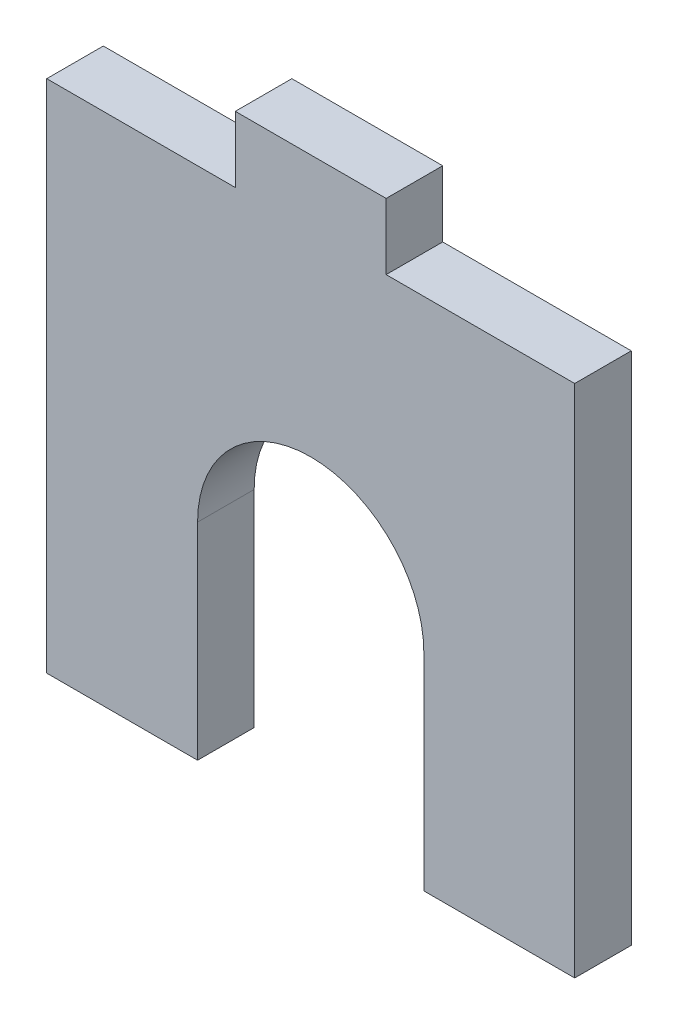
ISO-10303-21;
HEADER;
FILE_DESCRIPTION(('STEP AP214'),'2;1');
FILE_NAME('part.step','',(''),(''),'','','');
FILE_SCHEMA(('AUTOMOTIVE_DESIGN { 1 0 10303 214 1 1 1 1 }'));
ENDSEC;
DATA;
#1=APPLICATION_CONTEXT('core data for automotive mechanical design processes');
#2=APPLICATION_PROTOCOL_DEFINITION('international standard','automotive_design',2000,#1);
#3=PRODUCT_CONTEXT('',#1,'mechanical');
#4=PRODUCT('Part','Part','',(#3));
#5=PRODUCT_RELATED_PRODUCT_CATEGORY('part','',(#4));
#6=PRODUCT_DEFINITION_FORMATION('','',#4);
#7=PRODUCT_DEFINITION_CONTEXT('part definition',#1,'design');
#8=PRODUCT_DEFINITION('design','',#6,#7);
#9=PRODUCT_DEFINITION_SHAPE('','',#8);
#10=(LENGTH_UNIT() NAMED_UNIT(*) SI_UNIT(.MILLI.,.METRE.));
#11=(NAMED_UNIT(*) PLANE_ANGLE_UNIT() SI_UNIT($,.RADIAN.));
#12=(NAMED_UNIT(*) SI_UNIT($,.STERADIAN.) SOLID_ANGLE_UNIT());
#13=UNCERTAINTY_MEASURE_WITH_UNIT(LENGTH_MEASURE(1.E-05),#10,'distance_accuracy_value','');
#14=(GEOMETRIC_REPRESENTATION_CONTEXT(3) GLOBAL_UNCERTAINTY_ASSIGNED_CONTEXT((#13)) GLOBAL_UNIT_ASSIGNED_CONTEXT((#10,
#11,#12)) REPRESENTATION_CONTEXT('',''));
#15=CARTESIAN_POINT('',(0.,0.,0.));
#16=DIRECTION('',(0.,0.,1.));
#17=DIRECTION('',(1.,0.,0.));
#18=AXIS2_PLACEMENT_3D('',#15,#16,#17);
#19=CARTESIAN_POINT('',(-14.,-10.9375,3.));
#20=DIRECTION('',(1.,0.,0.));
#21=DIRECTION('',(0.,0.,-1.));
#22=AXIS2_PLACEMENT_3D('',#19,#20,#21);
#23=PLANE('',#22);
#24=DIRECTION('',(0.,-1.,0.));
#25=VECTOR('',#24,1.);
#26=CARTESIAN_POINT('',(-14.,-10.9375,0.));
#27=LINE('',#26,#25);
#28=CARTESIAN_POINT('',(-14.,16.3676805868088,0.));
#29=VERTEX_POINT('',#28);
#30=CARTESIAN_POINT('',(-14.,-10.9375,0.));
#31=VERTEX_POINT('',#30);
#32=EDGE_CURVE('E155',#29,#31,#27,.T.);
#33=ORIENTED_EDGE('',*,*,#32,.T.);
#34=DIRECTION('',(0.,0.,-1.));
#35=VECTOR('',#34,1.);
#36=CARTESIAN_POINT('',(-14.,-10.9375,3.));
#37=LINE('',#36,#35);
#38=CARTESIAN_POINT('',(-14.,-10.9375,3.));
#39=VERTEX_POINT('',#38);
#40=EDGE_CURVE('E11',#39,#31,#37,.T.);
#41=ORIENTED_EDGE('',*,*,#40,.F.);
#42=DIRECTION('',(0.,-1.,0.));
#43=VECTOR('',#42,1.);
#44=CARTESIAN_POINT('',(-14.,-10.9375,3.));
#45=LINE('',#44,#43);
#46=CARTESIAN_POINT('',(-14.,16.3676805868088,3.));
#47=VERTEX_POINT('',#46);
#48=EDGE_CURVE('E177',#47,#39,#45,.T.);
#49=ORIENTED_EDGE('',*,*,#48,.F.);
#50=DIRECTION('',(0.,0.,-1.));
#51=VECTOR('',#50,1.);
#52=CARTESIAN_POINT('',(-14.,16.3676805868088,3.));
#53=LINE('',#52,#51);
#54=EDGE_CURVE('E151',#47,#29,#53,.T.);
#55=ORIENTED_EDGE('',*,*,#54,.T.);
#56=EDGE_LOOP('',(#33,#41,#49,#55));
#57=FACE_BOUND('',#56,.T.);
#58=ADVANCED_FACE('F35',(#57),#23,.F.);
#59=CARTESIAN_POINT('',(-14.,-10.9375,3.));
#60=DIRECTION('',(0.,1.,0.));
#61=DIRECTION('',(0.,0.,1.));
#62=AXIS2_PLACEMENT_3D('',#59,#60,#61);
#63=PLANE('',#62);
#64=DIRECTION('',(1.,0.,0.));
#65=VECTOR('',#64,1.);
#66=CARTESIAN_POINT('',(-14.,-10.9375,0.));
#67=LINE('',#66,#65);
#68=CARTESIAN_POINT('',(-6.,-10.9375,0.));
#69=VERTEX_POINT('',#68);
#70=EDGE_CURVE('E158',#31,#69,#67,.T.);
#71=ORIENTED_EDGE('',*,*,#70,.T.);
#72=DIRECTION('',(0.,0.,-1.));
#73=VECTOR('',#72,1.);
#74=CARTESIAN_POINT('',(-6.,-10.9375,3.));
#75=LINE('',#74,#73);
#76=CARTESIAN_POINT('',(-6.,-10.9375,3.));
#77=VERTEX_POINT('',#76);
#78=EDGE_CURVE('E43',#77,#69,#75,.T.);
#79=ORIENTED_EDGE('',*,*,#78,.F.);
#80=DIRECTION('',(1.,0.,0.));
#81=VECTOR('',#80,1.);
#82=CARTESIAN_POINT('',(-14.,-10.9375,3.));
#83=LINE('',#82,#81);
#84=EDGE_CURVE('E106',#39,#77,#83,.T.);
#85=ORIENTED_EDGE('',*,*,#84,.F.);
#86=ORIENTED_EDGE('',*,*,#40,.T.);
#87=EDGE_LOOP('',(#71,#79,#85,#86));
#88=FACE_BOUND('',#87,.T.);
#89=ADVANCED_FACE('F255',(#88),#63,.F.);
#90=CARTESIAN_POINT('',(-6.,0.,3.));
#91=DIRECTION('',(-1.,0.,0.));
#92=DIRECTION('',(0.,-1.,0.));
#93=AXIS2_PLACEMENT_3D('',#90,#91,#92);
#94=PLANE('',#93);
#95=DIRECTION('',(0.,1.,0.));
#96=VECTOR('',#95,1.);
#97=CARTESIAN_POINT('',(-6.,0.,0.));
#98=LINE('',#97,#96);
#99=CARTESIAN_POINT('',(-6.,0.,0.));
#100=VERTEX_POINT('',#99);
#101=EDGE_CURVE('E160',#69,#100,#98,.T.);
#102=ORIENTED_EDGE('',*,*,#101,.T.);
#103=DIRECTION('',(0.,0.,-1.));
#104=VECTOR('',#103,1.);
#105=CARTESIAN_POINT('',(-6.,0.,3.));
#106=LINE('',#105,#104);
#107=CARTESIAN_POINT('',(-6.,0.,3.));
#108=VERTEX_POINT('',#107);
#109=EDGE_CURVE('E196',#108,#100,#106,.T.);
#110=ORIENTED_EDGE('',*,*,#109,.F.);
#111=DIRECTION('',(0.,1.,0.));
#112=VECTOR('',#111,1.);
#113=CARTESIAN_POINT('',(-6.,0.,3.));
#114=LINE('',#113,#112);
#115=EDGE_CURVE('E204',#77,#108,#114,.T.);
#116=ORIENTED_EDGE('',*,*,#115,.F.);
#117=ORIENTED_EDGE('',*,*,#78,.T.);
#118=EDGE_LOOP('',(#102,#110,#116,#117));
#119=FACE_BOUND('',#118,.T.);
#120=ADVANCED_FACE('F202',(#119),#94,.F.);
#121=CARTESIAN_POINT('',(0.,0.,3.));
#122=DIRECTION('',(0.,0.,-1.));
#123=DIRECTION('',(-1.,0.,0.));
#124=AXIS2_PLACEMENT_3D('',#121,#122,#123);
#125=CYLINDRICAL_SURFACE('',#124,6.);
#126=CARTESIAN_POINT('',(0.,0.,0.));
#127=DIRECTION('',(0.,0.,-1.));
#128=DIRECTION('',(1.,0.,0.));
#129=AXIS2_PLACEMENT_3D('',#126,#127,#128);
#130=CIRCLE('',#129,6.);
#131=CARTESIAN_POINT('',(6.,0.,0.));
#132=VERTEX_POINT('',#131);
#133=EDGE_CURVE('E162',#100,#132,#130,.T.);
#134=ORIENTED_EDGE('',*,*,#133,.T.);
#135=DIRECTION('',(0.,0.,-1.));
#136=VECTOR('',#135,1.);
#137=CARTESIAN_POINT('',(6.,0.,3.));
#138=LINE('',#137,#136);
#139=CARTESIAN_POINT('',(6.,0.,3.));
#140=VERTEX_POINT('',#139);
#141=EDGE_CURVE('E193',#140,#132,#138,.T.);
#142=ORIENTED_EDGE('',*,*,#141,.F.);
#143=CARTESIAN_POINT('',(0.,0.,3.));
#144=DIRECTION('',(0.,0.,-1.));
#145=DIRECTION('',(1.,0.,0.));
#146=AXIS2_PLACEMENT_3D('',#143,#144,#145);
#147=CIRCLE('',#146,6.);
#148=EDGE_CURVE('E222',#108,#140,#147,.T.);
#149=ORIENTED_EDGE('',*,*,#148,.F.);
#150=ORIENTED_EDGE('',*,*,#109,.T.);
#151=EDGE_LOOP('',(#134,#142,#149,#150));
#152=FACE_BOUND('',#151,.T.);
#153=ADVANCED_FACE('F213',(#152),#125,.F.);
#154=CARTESIAN_POINT('',(6.,0.,3.));
#155=DIRECTION('',(1.,0.,0.));
#156=DIRECTION('',(0.,1.,0.));
#157=AXIS2_PLACEMENT_3D('',#154,#155,#156);
#158=PLANE('',#157);
#159=DIRECTION('',(0.,-1.,0.));
#160=VECTOR('',#159,1.);
#161=CARTESIAN_POINT('',(6.,0.,0.));
#162=LINE('',#161,#160);
#163=CARTESIAN_POINT('',(6.,-10.9375,0.));
#164=VERTEX_POINT('',#163);
#165=EDGE_CURVE('E164',#132,#164,#162,.T.);
#166=ORIENTED_EDGE('',*,*,#165,.T.);
#167=DIRECTION('',(0.,0.,-1.));
#168=VECTOR('',#167,1.);
#169=CARTESIAN_POINT('',(6.,-10.9375,3.));
#170=LINE('',#169,#168);
#171=CARTESIAN_POINT('',(6.,-10.9375,3.));
#172=VERTEX_POINT('',#171);
#173=EDGE_CURVE('E190',#172,#164,#170,.T.);
#174=ORIENTED_EDGE('',*,*,#173,.F.);
#175=DIRECTION('',(0.,-1.,0.));
#176=VECTOR('',#175,1.);
#177=CARTESIAN_POINT('',(6.,0.,3.));
#178=LINE('',#177,#176);
#179=EDGE_CURVE('E219',#140,#172,#178,.T.);
#180=ORIENTED_EDGE('',*,*,#179,.F.);
#181=ORIENTED_EDGE('',*,*,#141,.T.);
#182=EDGE_LOOP('',(#166,#174,#180,#181));
#183=FACE_BOUND('',#182,.T.);
#184=ADVANCED_FACE('F217',(#183),#158,.F.);
#185=CARTESIAN_POINT('',(6.,-10.9375,3.));
#186=DIRECTION('',(0.,1.,0.));
#187=DIRECTION('',(0.,0.,1.));
#188=AXIS2_PLACEMENT_3D('',#185,#186,#187);
#189=PLANE('',#188);
#190=DIRECTION('',(1.,0.,0.));
#191=VECTOR('',#190,1.);
#192=CARTESIAN_POINT('',(6.,-10.9375,0.));
#193=LINE('',#192,#191);
#194=CARTESIAN_POINT('',(14.,-10.9375,0.));
#195=VERTEX_POINT('',#194);
#196=EDGE_CURVE('E166',#164,#195,#193,.T.);
#197=ORIENTED_EDGE('',*,*,#196,.T.);
#198=DIRECTION('',(0.,0.,-1.));
#199=VECTOR('',#198,1.);
#200=CARTESIAN_POINT('',(14.,-10.9375,3.));
#201=LINE('',#200,#199);
#202=CARTESIAN_POINT('',(14.,-10.9375,3.));
#203=VERTEX_POINT('',#202);
#204=EDGE_CURVE('E187',#203,#195,#201,.T.);
#205=ORIENTED_EDGE('',*,*,#204,.F.);
#206=DIRECTION('',(1.,0.,0.));
#207=VECTOR('',#206,1.);
#208=CARTESIAN_POINT('',(6.,-10.9375,3.));
#209=LINE('',#208,#207);
#210=EDGE_CURVE('E221',#172,#203,#209,.T.);
#211=ORIENTED_EDGE('',*,*,#210,.F.);
#212=ORIENTED_EDGE('',*,*,#173,.T.);
#213=EDGE_LOOP('',(#197,#205,#211,#212));
#214=FACE_BOUND('',#213,.T.);
#215=ADVANCED_FACE('F268',(#214),#189,.F.);
#216=CARTESIAN_POINT('',(14.,-10.9375,3.));
#217=DIRECTION('',(-1.,0.,0.));
#218=DIRECTION('',(0.,0.,1.));
#219=AXIS2_PLACEMENT_3D('',#216,#217,#218);
#220=PLANE('',#219);
#221=DIRECTION('',(0.,1.,0.));
#222=VECTOR('',#221,1.);
#223=CARTESIAN_POINT('',(14.,-10.9375,0.));
#224=LINE('',#223,#222);
#225=CARTESIAN_POINT('',(14.,16.3676805868088,0.));
#226=VERTEX_POINT('',#225);
#227=EDGE_CURVE('E168',#195,#226,#224,.T.);
#228=ORIENTED_EDGE('',*,*,#227,.T.);
#229=DIRECTION('',(0.,0.,-1.));
#230=VECTOR('',#229,1.);
#231=CARTESIAN_POINT('',(14.,16.3676805868088,3.));
#232=LINE('',#231,#230);
#233=CARTESIAN_POINT('',(14.,16.3676805868088,3.));
#234=VERTEX_POINT('',#233);
#235=EDGE_CURVE('E184',#234,#226,#232,.T.);
#236=ORIENTED_EDGE('',*,*,#235,.F.);
#237=DIRECTION('',(0.,1.,0.));
#238=VECTOR('',#237,1.);
#239=CARTESIAN_POINT('',(14.,-10.9375,3.));
#240=LINE('',#239,#238);
#241=EDGE_CURVE('E224',#203,#234,#240,.T.);
#242=ORIENTED_EDGE('',*,*,#241,.F.);
#243=ORIENTED_EDGE('',*,*,#204,.T.);
#244=EDGE_LOOP('',(#228,#236,#242,#243));
#245=FACE_BOUND('',#244,.T.);
#246=ADVANCED_FACE('F271',(#245),#220,.F.);
#247=CARTESIAN_POINT('',(4.,16.3676805868088,3.));
#248=DIRECTION('',(0.,-1.,0.));
#249=DIRECTION('',(0.,0.,-1.));
#250=AXIS2_PLACEMENT_3D('',#247,#248,#249);
#251=PLANE('',#250);
#252=DIRECTION('',(-1.,0.,0.));
#253=VECTOR('',#252,1.);
#254=CARTESIAN_POINT('',(4.,16.3676805868088,0.));
#255=LINE('',#254,#253);
#256=CARTESIAN_POINT('',(4.,16.3676805868088,0.));
#257=VERTEX_POINT('',#256);
#258=EDGE_CURVE('E170',#226,#257,#255,.T.);
#259=ORIENTED_EDGE('',*,*,#258,.T.);
#260=DIRECTION('',(0.,0.,-1.));
#261=VECTOR('',#260,1.);
#262=CARTESIAN_POINT('',(4.,16.3676805868088,3.));
#263=LINE('',#262,#261);
#264=CARTESIAN_POINT('',(4.,16.3676805868088,3.));
#265=VERTEX_POINT('',#264);
#266=EDGE_CURVE('E181',#265,#257,#263,.T.);
#267=ORIENTED_EDGE('',*,*,#266,.F.);
#268=DIRECTION('',(-1.,0.,0.));
#269=VECTOR('',#268,1.);
#270=CARTESIAN_POINT('',(4.,16.3676805868088,3.));
#271=LINE('',#270,#269);
#272=EDGE_CURVE('E230',#234,#265,#271,.T.);
#273=ORIENTED_EDGE('',*,*,#272,.F.);
#274=ORIENTED_EDGE('',*,*,#235,.T.);
#275=EDGE_LOOP('',(#259,#267,#273,#274));
#276=FACE_BOUND('',#275,.T.);
#277=ADVANCED_FACE('F236',(#276),#251,.F.);
#278=CARTESIAN_POINT('',(4.,16.3676805868088,3.));
#279=DIRECTION('',(-1.,0.,0.));
#280=DIRECTION('',(0.,0.,1.));
#281=AXIS2_PLACEMENT_3D('',#278,#279,#280);
#282=PLANE('',#281);
#283=DIRECTION('',(0.,1.,0.));
#284=VECTOR('',#283,1.);
#285=CARTESIAN_POINT('',(4.,16.3676805868088,0.));
#286=LINE('',#285,#284);
#287=CARTESIAN_POINT('',(4.,19.8676805868088,0.));
#288=VERTEX_POINT('',#287);
#289=EDGE_CURVE('E172',#257,#288,#286,.T.);
#290=ORIENTED_EDGE('',*,*,#289,.T.);
#291=DIRECTION('',(0.,0.,-1.));
#292=VECTOR('',#291,1.);
#293=CARTESIAN_POINT('',(4.,19.8676805868088,3.));
#294=LINE('',#293,#292);
#295=CARTESIAN_POINT('',(4.,19.8676805868088,3.));
#296=VERTEX_POINT('',#295);
#297=EDGE_CURVE('E146',#296,#288,#294,.T.);
#298=ORIENTED_EDGE('',*,*,#297,.F.);
#299=DIRECTION('',(0.,1.,0.));
#300=VECTOR('',#299,1.);
#301=CARTESIAN_POINT('',(4.,16.3676805868088,3.));
#302=LINE('',#301,#300);
#303=EDGE_CURVE('E137',#265,#296,#302,.T.);
#304=ORIENTED_EDGE('',*,*,#303,.F.);
#305=ORIENTED_EDGE('',*,*,#266,.T.);
#306=EDGE_LOOP('',(#290,#298,#304,#305));
#307=FACE_BOUND('',#306,.T.);
#308=ADVANCED_FACE('F240',(#307),#282,.F.);
#309=CARTESIAN_POINT('',(-4.,19.8676805868088,3.));
#310=DIRECTION('',(0.,-1.,0.));
#311=DIRECTION('',(0.,0.,-1.));
#312=AXIS2_PLACEMENT_3D('',#309,#310,#311);
#313=PLANE('',#312);
#314=DIRECTION('',(-1.,0.,0.));
#315=VECTOR('',#314,1.);
#316=CARTESIAN_POINT('',(-4.,19.8676805868088,0.));
#317=LINE('',#316,#315);
#318=CARTESIAN_POINT('',(-4.,19.8676805868088,0.));
#319=VERTEX_POINT('',#318);
#320=EDGE_CURVE('E145',#288,#319,#317,.T.);
#321=ORIENTED_EDGE('',*,*,#320,.T.);
#322=DIRECTION('',(0.,0.,-1.));
#323=VECTOR('',#322,1.);
#324=CARTESIAN_POINT('',(-4.,19.8676805868088,3.));
#325=LINE('',#324,#323);
#326=CARTESIAN_POINT('',(-4.,19.8676805868088,3.));
#327=VERTEX_POINT('',#326);
#328=EDGE_CURVE('E142',#327,#319,#325,.T.);
#329=ORIENTED_EDGE('',*,*,#328,.F.);
#330=DIRECTION('',(-1.,0.,0.));
#331=VECTOR('',#330,1.);
#332=CARTESIAN_POINT('',(-4.,19.8676805868088,3.));
#333=LINE('',#332,#331);
#334=EDGE_CURVE('E131',#296,#327,#333,.T.);
#335=ORIENTED_EDGE('',*,*,#334,.F.);
#336=ORIENTED_EDGE('',*,*,#297,.T.);
#337=EDGE_LOOP('',(#321,#329,#335,#336));
#338=FACE_BOUND('',#337,.T.);
#339=ADVANCED_FACE('F143',(#338),#313,.F.);
#340=CARTESIAN_POINT('',(-4.,16.3676805868088,3.));
#341=DIRECTION('',(1.,0.,0.));
#342=DIRECTION('',(0.,0.,-1.));
#343=AXIS2_PLACEMENT_3D('',#340,#341,#342);
#344=PLANE('',#343);
#345=DIRECTION('',(0.,-1.,0.));
#346=VECTOR('',#345,1.);
#347=CARTESIAN_POINT('',(-4.,16.3676805868088,0.));
#348=LINE('',#347,#346);
#349=CARTESIAN_POINT('',(-4.,16.3676805868088,0.));
#350=VERTEX_POINT('',#349);
#351=EDGE_CURVE('E92',#319,#350,#348,.T.);
#352=ORIENTED_EDGE('',*,*,#351,.T.);
#353=DIRECTION('',(0.,0.,-1.));
#354=VECTOR('',#353,1.);
#355=CARTESIAN_POINT('',(-4.,16.3676805868088,3.));
#356=LINE('',#355,#354);
#357=CARTESIAN_POINT('',(-4.,16.3676805868088,3.));
#358=VERTEX_POINT('',#357);
#359=EDGE_CURVE('E147',#358,#350,#356,.T.);
#360=ORIENTED_EDGE('',*,*,#359,.F.);
#361=DIRECTION('',(0.,-1.,0.));
#362=VECTOR('',#361,1.);
#363=CARTESIAN_POINT('',(-4.,16.3676805868088,3.));
#364=LINE('',#363,#362);
#365=EDGE_CURVE('E135',#327,#358,#364,.T.);
#366=ORIENTED_EDGE('',*,*,#365,.F.);
#367=ORIENTED_EDGE('',*,*,#328,.T.);
#368=EDGE_LOOP('',(#352,#360,#366,#367));
#369=FACE_BOUND('',#368,.T.);
#370=ADVANCED_FACE('F149',(#369),#344,.F.);
#371=CARTESIAN_POINT('',(-14.,16.3676805868088,3.));
#372=DIRECTION('',(0.,-1.,0.));
#373=DIRECTION('',(0.,0.,-1.));
#374=AXIS2_PLACEMENT_3D('',#371,#372,#373);
#375=PLANE('',#374);
#376=DIRECTION('',(-1.,0.,0.));
#377=VECTOR('',#376,1.);
#378=CARTESIAN_POINT('',(-14.,16.3676805868088,0.));
#379=LINE('',#378,#377);
#380=EDGE_CURVE('E98',#350,#29,#379,.T.);
#381=ORIENTED_EDGE('',*,*,#380,.T.);
#382=ORIENTED_EDGE('',*,*,#54,.F.);
#383=DIRECTION('',(-1.,0.,0.));
#384=VECTOR('',#383,1.);
#385=CARTESIAN_POINT('',(-14.,16.3676805868088,3.));
#386=LINE('',#385,#384);
#387=EDGE_CURVE('E51',#358,#47,#386,.T.);
#388=ORIENTED_EDGE('',*,*,#387,.F.);
#389=ORIENTED_EDGE('',*,*,#359,.T.);
#390=EDGE_LOOP('',(#381,#382,#388,#389));
#391=FACE_BOUND('',#390,.T.);
#392=ADVANCED_FACE('F244',(#391),#375,.F.);
#393=CARTESIAN_POINT('',(0.,0.,3.));
#394=DIRECTION('',(0.,0.,1.));
#395=DIRECTION('',(1.,0.,0.));
#396=AXIS2_PLACEMENT_3D('',#393,#394,#395);
#397=PLANE('',#396);
#398=ORIENTED_EDGE('',*,*,#48,.T.);
#399=ORIENTED_EDGE('',*,*,#84,.T.);
#400=ORIENTED_EDGE('',*,*,#115,.T.);
#401=ORIENTED_EDGE('',*,*,#148,.T.);
#402=ORIENTED_EDGE('',*,*,#179,.T.);
#403=ORIENTED_EDGE('',*,*,#210,.T.);
#404=ORIENTED_EDGE('',*,*,#241,.T.);
#405=ORIENTED_EDGE('',*,*,#272,.T.);
#406=ORIENTED_EDGE('',*,*,#303,.T.);
#407=ORIENTED_EDGE('',*,*,#334,.T.);
#408=ORIENTED_EDGE('',*,*,#365,.T.);
#409=ORIENTED_EDGE('',*,*,#387,.T.);
#410=EDGE_LOOP('',(#398,#399,#400,#401,#402,#403,#404,#405,#406,#407,#408,#409));
#411=FACE_BOUND('',#410,.T.);
#412=ADVANCED_FACE('F133',(#411),#397,.T.);
#413=CARTESIAN_POINT('',(0.,0.,0.));
#414=DIRECTION('',(0.,0.,1.));
#415=DIRECTION('',(1.,0.,0.));
#416=AXIS2_PLACEMENT_3D('',#413,#414,#415);
#417=PLANE('',#416);
#418=ORIENTED_EDGE('',*,*,#32,.F.);
#419=ORIENTED_EDGE('',*,*,#380,.F.);
#420=ORIENTED_EDGE('',*,*,#351,.F.);
#421=ORIENTED_EDGE('',*,*,#320,.F.);
#422=ORIENTED_EDGE('',*,*,#289,.F.);
#423=ORIENTED_EDGE('',*,*,#258,.F.);
#424=ORIENTED_EDGE('',*,*,#227,.F.);
#425=ORIENTED_EDGE('',*,*,#196,.F.);
#426=ORIENTED_EDGE('',*,*,#165,.F.);
#427=ORIENTED_EDGE('',*,*,#133,.F.);
#428=ORIENTED_EDGE('',*,*,#101,.F.);
#429=ORIENTED_EDGE('',*,*,#70,.F.);
#430=EDGE_LOOP('',(#418,#419,#420,#421,#422,#423,#424,#425,#426,#427,#428,#429));
#431=FACE_BOUND('',#430,.T.);
#432=ADVANCED_FACE('F208',(#431),#417,.F.);
#433=CLOSED_SHELL('',(#58,#89,#120,#153,#184,#215,#246,#277,#308,#339,#370,#392,#412,#432));
#434=MANIFOLD_SOLID_BREP('B2',#433);
#435=ADVANCED_BREP_SHAPE_REPRESENTATION('',(#18,#434),#14);
#436=SHAPE_DEFINITION_REPRESENTATION(#9,#435);
ENDSEC;
END-ISO-10303-21;
